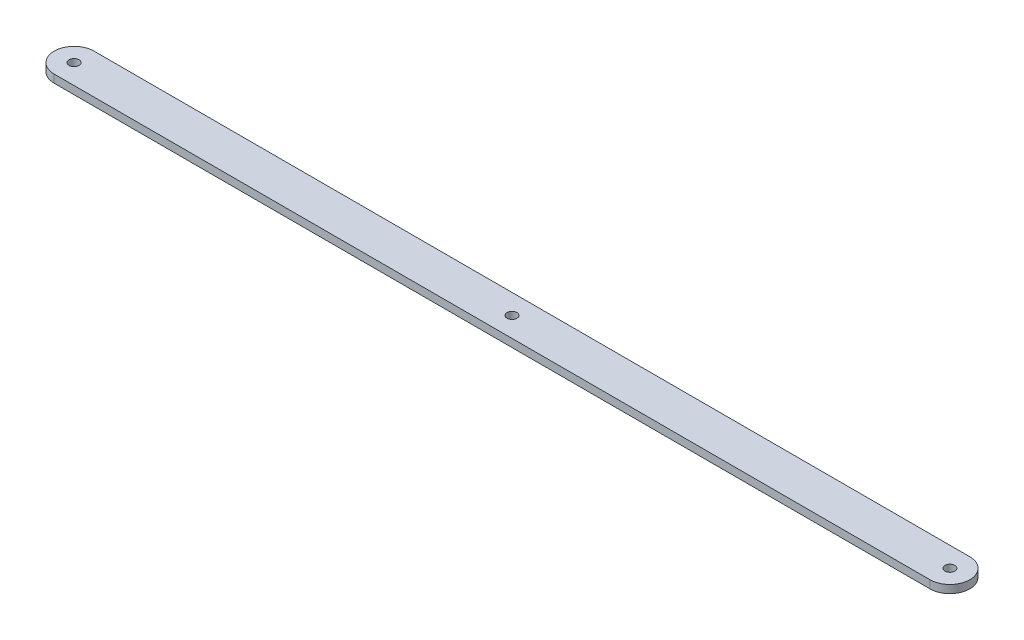
ISO-10303-21;
HEADER;
FILE_DESCRIPTION(('STEP AP214'),'2;1');
FILE_NAME('part.step','',(''),(''),'','','');
FILE_SCHEMA(('AUTOMOTIVE_DESIGN { 1 0 10303 214 1 1 1 1 }'));
ENDSEC;
DATA;
#1=APPLICATION_CONTEXT('core data for automotive mechanical design processes');
#2=APPLICATION_PROTOCOL_DEFINITION('international standard','automotive_design',2000,#1);
#3=PRODUCT_CONTEXT('',#1,'mechanical');
#4=PRODUCT('Part','Part','',(#3));
#5=PRODUCT_RELATED_PRODUCT_CATEGORY('part','',(#4));
#6=PRODUCT_DEFINITION_FORMATION('','',#4);
#7=PRODUCT_DEFINITION_CONTEXT('part definition',#1,'design');
#8=PRODUCT_DEFINITION('design','',#6,#7);
#9=PRODUCT_DEFINITION_SHAPE('','',#8);
#10=(LENGTH_UNIT() NAMED_UNIT(*) SI_UNIT(.MILLI.,.METRE.));
#11=(NAMED_UNIT(*) PLANE_ANGLE_UNIT() SI_UNIT($,.RADIAN.));
#12=(NAMED_UNIT(*) SI_UNIT($,.STERADIAN.) SOLID_ANGLE_UNIT());
#13=UNCERTAINTY_MEASURE_WITH_UNIT(LENGTH_MEASURE(1.E-05),#10,'distance_accuracy_value','');
#14=(GEOMETRIC_REPRESENTATION_CONTEXT(3) GLOBAL_UNCERTAINTY_ASSIGNED_CONTEXT((#13)) GLOBAL_UNIT_ASSIGNED_CONTEXT((#10,
#11,#12)) REPRESENTATION_CONTEXT('',''));
#15=CARTESIAN_POINT('',(0.,0.,0.));
#16=DIRECTION('',(0.,0.,1.));
#17=DIRECTION('',(1.,0.,0.));
#18=AXIS2_PLACEMENT_3D('',#15,#16,#17);
#19=CARTESIAN_POINT('',(-550.,10.,0.));
#20=DIRECTION('',(0.,-1.,0.));
#21=DIRECTION('',(0.,0.,-1.));
#22=AXIS2_PLACEMENT_3D('',#19,#20,#21);
#23=PLANE('',#22);
#24=CARTESIAN_POINT('',(0.,10.,0.));
#25=DIRECTION('',(0.,1.,0.));
#26=DIRECTION('',(0.,0.,1.));
#27=AXIS2_PLACEMENT_3D('',#24,#25,#26);
#28=CIRCLE('',#27,6.25000000000001);
#29=CARTESIAN_POINT('',(0.,10.,6.25000000000001));
#30=VERTEX_POINT('',#29);
#31=EDGE_CURVE('E124',#30,#30,#28,.T.);
#32=ORIENTED_EDGE('',*,*,#31,.F.);
#33=EDGE_LOOP('',(#32));
#34=FACE_BOUND('',#33,.T.);
#35=CARTESIAN_POINT('',(-550.,10.,0.));
#36=DIRECTION('',(0.,1.,0.));
#37=DIRECTION('',(0.,0.,-1.));
#38=AXIS2_PLACEMENT_3D('',#35,#36,#37);
#39=CIRCLE('',#38,25.);
#40=CARTESIAN_POINT('',(-550.,10.,-25.));
#41=VERTEX_POINT('',#40);
#42=CARTESIAN_POINT('',(-550.,10.,25.));
#43=VERTEX_POINT('',#42);
#44=EDGE_CURVE('E85',#41,#43,#39,.T.);
#45=ORIENTED_EDGE('',*,*,#44,.T.);
#46=DIRECTION('',(1.,0.,0.));
#47=VECTOR('',#46,1.);
#48=CARTESIAN_POINT('',(-550.,10.,25.));
#49=LINE('',#48,#47);
#50=CARTESIAN_POINT('',(550.,10.,25.));
#51=VERTEX_POINT('',#50);
#52=EDGE_CURVE('E80',#43,#51,#49,.T.);
#53=ORIENTED_EDGE('',*,*,#52,.T.);
#54=CARTESIAN_POINT('',(550.,10.,0.));
#55=DIRECTION('',(0.,1.,0.));
#56=DIRECTION('',(0.,0.,-1.));
#57=AXIS2_PLACEMENT_3D('',#54,#55,#56);
#58=CIRCLE('',#57,25.);
#59=CARTESIAN_POINT('',(550.,10.,-25.));
#60=VERTEX_POINT('',#59);
#61=EDGE_CURVE('E83',#51,#60,#58,.T.);
#62=ORIENTED_EDGE('',*,*,#61,.T.);
#63=DIRECTION('',(-1.,0.,0.));
#64=VECTOR('',#63,1.);
#65=CARTESIAN_POINT('',(-550.,10.,-25.));
#66=LINE('',#65,#64);
#67=EDGE_CURVE('E50',#60,#41,#66,.T.);
#68=ORIENTED_EDGE('',*,*,#67,.T.);
#69=EDGE_LOOP('',(#45,#53,#62,#68));
#70=FACE_BOUND('',#69,.T.);
#71=CARTESIAN_POINT('',(-550.,10.,0.));
#72=DIRECTION('',(0.,1.,0.));
#73=DIRECTION('',(0.,0.,1.));
#74=AXIS2_PLACEMENT_3D('',#71,#72,#73);
#75=CIRCLE('',#74,6.25);
#76=CARTESIAN_POINT('',(-550.,10.,6.25));
#77=VERTEX_POINT('',#76);
#78=EDGE_CURVE('E100',#77,#77,#75,.T.);
#79=ORIENTED_EDGE('',*,*,#78,.F.);
#80=EDGE_LOOP('',(#79));
#81=FACE_BOUND('',#80,.T.);
#82=CARTESIAN_POINT('',(550.,10.,0.));
#83=DIRECTION('',(0.,1.,0.));
#84=DIRECTION('',(0.,0.,1.));
#85=AXIS2_PLACEMENT_3D('',#82,#83,#84);
#86=CIRCLE('',#85,6.25);
#87=CARTESIAN_POINT('',(550.,10.,6.25));
#88=VERTEX_POINT('',#87);
#89=EDGE_CURVE('E115',#88,#88,#86,.T.);
#90=ORIENTED_EDGE('',*,*,#89,.F.);
#91=EDGE_LOOP('',(#90));
#92=FACE_BOUND('',#91,.T.);
#93=ADVANCED_FACE('F33',(#34,#70,#81,#92),#23,.F.);
#94=CARTESIAN_POINT('',(-550.,0.,0.));
#95=DIRECTION('',(0.,-1.,0.));
#96=DIRECTION('',(0.,0.,-1.));
#97=AXIS2_PLACEMENT_3D('',#94,#95,#96);
#98=PLANE('',#97);
#99=CARTESIAN_POINT('',(0.,0.,0.));
#100=DIRECTION('',(0.,1.,0.));
#101=DIRECTION('',(0.,0.,1.));
#102=AXIS2_PLACEMENT_3D('',#99,#100,#101);
#103=CIRCLE('',#102,6.25000000000001);
#104=CARTESIAN_POINT('',(0.,0.,6.25000000000001));
#105=VERTEX_POINT('',#104);
#106=EDGE_CURVE('E121',#105,#105,#103,.T.);
#107=ORIENTED_EDGE('',*,*,#106,.T.);
#108=EDGE_LOOP('',(#107));
#109=FACE_BOUND('',#108,.T.);
#110=CARTESIAN_POINT('',(-550.,0.,0.));
#111=DIRECTION('',(0.,1.,0.));
#112=DIRECTION('',(0.,0.,1.));
#113=AXIS2_PLACEMENT_3D('',#110,#111,#112);
#114=CIRCLE('',#113,6.25);
#115=CARTESIAN_POINT('',(-550.,0.,6.25));
#116=VERTEX_POINT('',#115);
#117=EDGE_CURVE('E112',#116,#116,#114,.T.);
#118=ORIENTED_EDGE('',*,*,#117,.T.);
#119=EDGE_LOOP('',(#118));
#120=FACE_BOUND('',#119,.T.);
#121=CARTESIAN_POINT('',(-550.,0.,0.));
#122=DIRECTION('',(0.,1.,0.));
#123=DIRECTION('',(0.,0.,-1.));
#124=AXIS2_PLACEMENT_3D('',#121,#122,#123);
#125=CIRCLE('',#124,25.);
#126=CARTESIAN_POINT('',(-550.,0.,-25.));
#127=VERTEX_POINT('',#126);
#128=CARTESIAN_POINT('',(-550.,0.,25.));
#129=VERTEX_POINT('',#128);
#130=EDGE_CURVE('E97',#127,#129,#125,.T.);
#131=ORIENTED_EDGE('',*,*,#130,.F.);
#132=DIRECTION('',(-1.,0.,0.));
#133=VECTOR('',#132,1.);
#134=CARTESIAN_POINT('',(-550.,0.,-25.));
#135=LINE('',#134,#133);
#136=CARTESIAN_POINT('',(550.,0.,-25.));
#137=VERTEX_POINT('',#136);
#138=EDGE_CURVE('E73',#137,#127,#135,.T.);
#139=ORIENTED_EDGE('',*,*,#138,.F.);
#140=CARTESIAN_POINT('',(550.,0.,0.));
#141=DIRECTION('',(0.,1.,0.));
#142=DIRECTION('',(0.,0.,-1.));
#143=AXIS2_PLACEMENT_3D('',#140,#141,#142);
#144=CIRCLE('',#143,25.);
#145=CARTESIAN_POINT('',(550.,0.,25.));
#146=VERTEX_POINT('',#145);
#147=EDGE_CURVE('E67',#146,#137,#144,.T.);
#148=ORIENTED_EDGE('',*,*,#147,.F.);
#149=DIRECTION('',(1.,0.,0.));
#150=VECTOR('',#149,1.);
#151=CARTESIAN_POINT('',(-550.,0.,25.));
#152=LINE('',#151,#150);
#153=EDGE_CURVE('E89',#129,#146,#152,.T.);
#154=ORIENTED_EDGE('',*,*,#153,.F.);
#155=EDGE_LOOP('',(#131,#139,#148,#154));
#156=FACE_BOUND('',#155,.T.);
#157=CARTESIAN_POINT('',(550.,0.,0.));
#158=DIRECTION('',(0.,1.,0.));
#159=DIRECTION('',(0.,0.,1.));
#160=AXIS2_PLACEMENT_3D('',#157,#158,#159);
#161=CIRCLE('',#160,6.25);
#162=CARTESIAN_POINT('',(550.,0.,6.25));
#163=VERTEX_POINT('',#162);
#164=EDGE_CURVE('E118',#163,#163,#161,.T.);
#165=ORIENTED_EDGE('',*,*,#164,.T.);
#166=EDGE_LOOP('',(#165));
#167=FACE_BOUND('',#166,.T.);
#168=ADVANCED_FACE('F108',(#109,#120,#156,#167),#98,.T.);
#169=CARTESIAN_POINT('',(-550.,10.,0.));
#170=DIRECTION('',(0.,-1.,0.));
#171=DIRECTION('',(0.,0.,-1.));
#172=AXIS2_PLACEMENT_3D('',#169,#170,#171);
#173=CYLINDRICAL_SURFACE('',#172,25.);
#174=ORIENTED_EDGE('',*,*,#130,.T.);
#175=DIRECTION('',(0.,-1.,0.));
#176=VECTOR('',#175,1.);
#177=CARTESIAN_POINT('',(-550.,10.,25.));
#178=LINE('',#177,#176);
#179=EDGE_CURVE('E11',#43,#129,#178,.T.);
#180=ORIENTED_EDGE('',*,*,#179,.F.);
#181=ORIENTED_EDGE('',*,*,#44,.F.);
#182=DIRECTION('',(0.,-1.,0.));
#183=VECTOR('',#182,1.);
#184=CARTESIAN_POINT('',(-550.,10.,-25.));
#185=LINE('',#184,#183);
#186=EDGE_CURVE('E93',#41,#127,#185,.T.);
#187=ORIENTED_EDGE('',*,*,#186,.T.);
#188=EDGE_LOOP('',(#174,#180,#181,#187));
#189=FACE_BOUND('',#188,.T.);
#190=ADVANCED_FACE('F35',(#189),#173,.T.);
#191=CARTESIAN_POINT('',(-550.,10.,25.));
#192=DIRECTION('',(0.,0.,-1.));
#193=DIRECTION('',(-1.,0.,0.));
#194=AXIS2_PLACEMENT_3D('',#191,#192,#193);
#195=PLANE('',#194);
#196=ORIENTED_EDGE('',*,*,#153,.T.);
#197=DIRECTION('',(0.,-1.,0.));
#198=VECTOR('',#197,1.);
#199=CARTESIAN_POINT('',(550.,10.,25.));
#200=LINE('',#199,#198);
#201=EDGE_CURVE('E42',#51,#146,#200,.T.);
#202=ORIENTED_EDGE('',*,*,#201,.F.);
#203=ORIENTED_EDGE('',*,*,#52,.F.);
#204=ORIENTED_EDGE('',*,*,#179,.T.);
#205=EDGE_LOOP('',(#196,#202,#203,#204));
#206=FACE_BOUND('',#205,.T.);
#207=ADVANCED_FACE('F88',(#206),#195,.F.);
#208=CARTESIAN_POINT('',(550.,10.,0.));
#209=DIRECTION('',(0.,-1.,0.));
#210=DIRECTION('',(0.,0.,-1.));
#211=AXIS2_PLACEMENT_3D('',#208,#209,#210);
#212=CYLINDRICAL_SURFACE('',#211,25.);
#213=ORIENTED_EDGE('',*,*,#147,.T.);
#214=DIRECTION('',(0.,-1.,0.));
#215=VECTOR('',#214,1.);
#216=CARTESIAN_POINT('',(550.,10.,-25.));
#217=LINE('',#216,#215);
#218=EDGE_CURVE('E90',#60,#137,#217,.T.);
#219=ORIENTED_EDGE('',*,*,#218,.F.);
#220=ORIENTED_EDGE('',*,*,#61,.F.);
#221=ORIENTED_EDGE('',*,*,#201,.T.);
#222=EDGE_LOOP('',(#213,#219,#220,#221));
#223=FACE_BOUND('',#222,.T.);
#224=ADVANCED_FACE('F91',(#223),#212,.T.);
#225=CARTESIAN_POINT('',(-550.,10.,-25.));
#226=DIRECTION('',(0.,0.,1.));
#227=DIRECTION('',(1.,0.,0.));
#228=AXIS2_PLACEMENT_3D('',#225,#226,#227);
#229=PLANE('',#228);
#230=ORIENTED_EDGE('',*,*,#138,.T.);
#231=ORIENTED_EDGE('',*,*,#186,.F.);
#232=ORIENTED_EDGE('',*,*,#67,.F.);
#233=ORIENTED_EDGE('',*,*,#218,.T.);
#234=EDGE_LOOP('',(#230,#231,#232,#233));
#235=FACE_BOUND('',#234,.T.);
#236=ADVANCED_FACE('F105',(#235),#229,.F.);
#237=CARTESIAN_POINT('',(-550.,10.,0.));
#238=DIRECTION('',(0.,-1.,0.));
#239=DIRECTION('',(0.,0.,-1.));
#240=AXIS2_PLACEMENT_3D('',#237,#238,#239);
#241=CYLINDRICAL_SURFACE('',#240,6.25);
#242=ORIENTED_EDGE('',*,*,#78,.T.);
#243=EDGE_LOOP('',(#242));
#244=FACE_BOUND('',#243,.T.);
#245=ORIENTED_EDGE('',*,*,#117,.F.);
#246=EDGE_LOOP('',(#245));
#247=FACE_BOUND('',#246,.T.);
#248=ADVANCED_FACE('F146',(#244,#247),#241,.F.);
#249=CARTESIAN_POINT('',(550.,10.,0.));
#250=DIRECTION('',(0.,-1.,0.));
#251=DIRECTION('',(0.,0.,-1.));
#252=AXIS2_PLACEMENT_3D('',#249,#250,#251);
#253=CYLINDRICAL_SURFACE('',#252,6.25);
#254=ORIENTED_EDGE('',*,*,#89,.T.);
#255=EDGE_LOOP('',(#254));
#256=FACE_BOUND('',#255,.T.);
#257=ORIENTED_EDGE('',*,*,#164,.F.);
#258=EDGE_LOOP('',(#257));
#259=FACE_BOUND('',#258,.T.);
#260=ADVANCED_FACE('F135',(#256,#259),#253,.F.);
#261=CARTESIAN_POINT('',(0.,0.,0.));
#262=DIRECTION('',(0.,1.,0.));
#263=DIRECTION('',(0.,0.,1.));
#264=AXIS2_PLACEMENT_3D('',#261,#262,#263);
#265=CYLINDRICAL_SURFACE('',#264,6.25000000000001);
#266=ORIENTED_EDGE('',*,*,#106,.F.);
#267=EDGE_LOOP('',(#266));
#268=FACE_BOUND('',#267,.T.);
#269=ORIENTED_EDGE('',*,*,#31,.T.);
#270=EDGE_LOOP('',(#269));
#271=FACE_BOUND('',#270,.T.);
#272=ADVANCED_FACE('F132',(#268,#271),#265,.F.);
#273=CLOSED_SHELL('',(#93,#168,#190,#207,#224,#236,#248,#260,#272));
#274=MANIFOLD_SOLID_BREP('B2',#273);
#275=ADVANCED_BREP_SHAPE_REPRESENTATION('',(#18,#274),#14);
#276=SHAPE_DEFINITION_REPRESENTATION(#9,#275);
ENDSEC;
END-ISO-10303-21;
